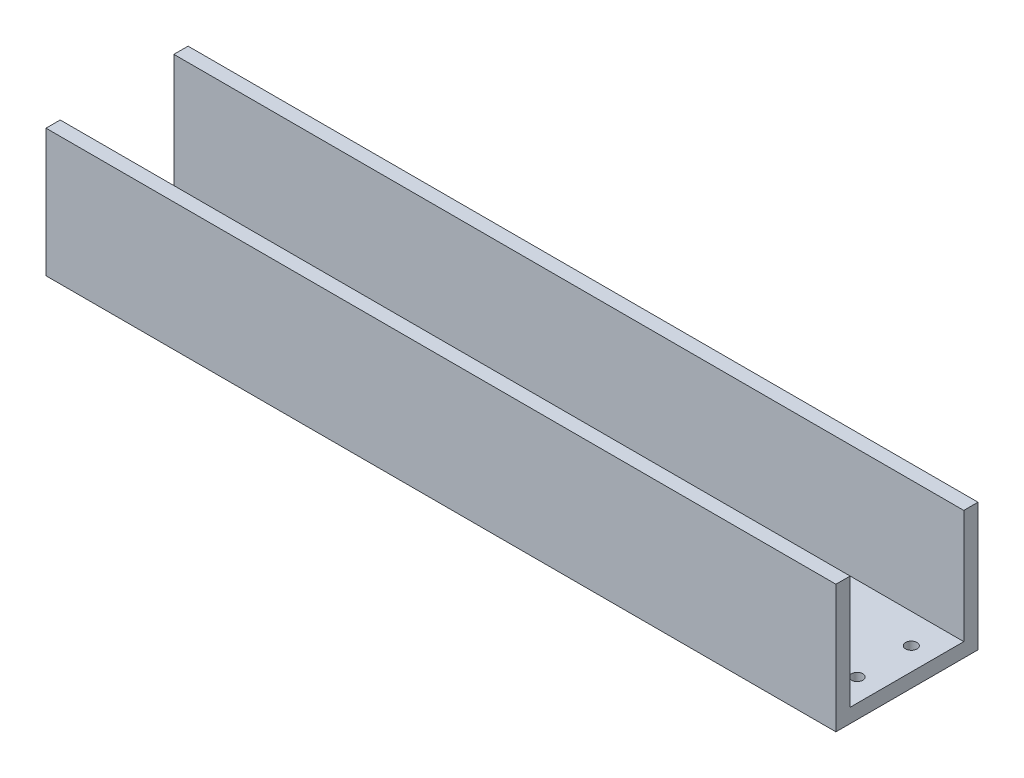
ISO-10303-21;
HEADER;
FILE_DESCRIPTION(('STEP AP214'),'2;1');
FILE_NAME('part.step','',(''),(''),'','','');
FILE_SCHEMA(('AUTOMOTIVE_DESIGN { 1 0 10303 214 1 1 1 1 }'));
ENDSEC;
DATA;
#1=APPLICATION_CONTEXT('core data for automotive mechanical design processes');
#2=APPLICATION_PROTOCOL_DEFINITION('international standard','automotive_design',2000,#1);
#3=PRODUCT_CONTEXT('',#1,'mechanical');
#4=PRODUCT('Part','Part','',(#3));
#5=PRODUCT_RELATED_PRODUCT_CATEGORY('part','',(#4));
#6=PRODUCT_DEFINITION_FORMATION('','',#4);
#7=PRODUCT_DEFINITION_CONTEXT('part definition',#1,'design');
#8=PRODUCT_DEFINITION('design','',#6,#7);
#9=PRODUCT_DEFINITION_SHAPE('','',#8);
#10=(LENGTH_UNIT() NAMED_UNIT(*) SI_UNIT(.MILLI.,.METRE.));
#11=(NAMED_UNIT(*) PLANE_ANGLE_UNIT() SI_UNIT($,.RADIAN.));
#12=(NAMED_UNIT(*) SI_UNIT($,.STERADIAN.) SOLID_ANGLE_UNIT());
#13=UNCERTAINTY_MEASURE_WITH_UNIT(LENGTH_MEASURE(1.E-05),#10,'distance_accuracy_value','');
#14=(GEOMETRIC_REPRESENTATION_CONTEXT(3) GLOBAL_UNCERTAINTY_ASSIGNED_CONTEXT((#13)) GLOBAL_UNIT_ASSIGNED_CONTEXT((#10,
#11,#12)) REPRESENTATION_CONTEXT('',''));
#15=CARTESIAN_POINT('',(0.,0.,0.));
#16=DIRECTION('',(0.,0.,1.));
#17=DIRECTION('',(1.,0.,0.));
#18=AXIS2_PLACEMENT_3D('',#15,#16,#17);
#19=CARTESIAN_POINT('',(278.,45.,0.));
#20=DIRECTION('',(0.,0.,-1.));
#21=DIRECTION('',(0.,1.,0.));
#22=AXIS2_PLACEMENT_3D('',#19,#20,#21);
#23=PLANE('',#22);
#24=DIRECTION('',(0.,-1.,0.));
#25=VECTOR('',#24,1.);
#26=CARTESIAN_POINT('',(0.,45.,0.));
#27=LINE('',#26,#25);
#28=CARTESIAN_POINT('',(0.,45.,0.));
#29=VERTEX_POINT('',#28);
#30=CARTESIAN_POINT('',(0.,0.,0.));
#31=VERTEX_POINT('',#30);
#32=EDGE_CURVE('E140',#29,#31,#27,.T.);
#33=ORIENTED_EDGE('',*,*,#32,.T.);
#34=DIRECTION('',(-1.,0.,0.));
#35=VECTOR('',#34,1.);
#36=CARTESIAN_POINT('',(278.,0.,0.));
#37=LINE('',#36,#35);
#38=CARTESIAN_POINT('',(278.,0.,0.));
#39=VERTEX_POINT('',#38);
#40=EDGE_CURVE('E11',#39,#31,#37,.T.);
#41=ORIENTED_EDGE('',*,*,#40,.F.);
#42=DIRECTION('',(0.,-1.,0.));
#43=VECTOR('',#42,1.);
#44=CARTESIAN_POINT('',(278.,45.,0.));
#45=LINE('',#44,#43);
#46=CARTESIAN_POINT('',(278.,45.,0.));
#47=VERTEX_POINT('',#46);
#48=EDGE_CURVE('E163',#47,#39,#45,.T.);
#49=ORIENTED_EDGE('',*,*,#48,.F.);
#50=DIRECTION('',(-1.,0.,0.));
#51=VECTOR('',#50,1.);
#52=CARTESIAN_POINT('',(278.,45.,0.));
#53=LINE('',#52,#51);
#54=EDGE_CURVE('E136',#47,#29,#53,.T.);
#55=ORIENTED_EDGE('',*,*,#54,.T.);
#56=EDGE_LOOP('',(#33,#41,#49,#55));
#57=FACE_BOUND('',#56,.T.);
#58=ADVANCED_FACE('F39',(#57),#23,.F.);
#59=CARTESIAN_POINT('',(278.,0.,0.));
#60=DIRECTION('',(0.,1.,0.));
#61=DIRECTION('',(0.,0.,1.));
#62=AXIS2_PLACEMENT_3D('',#59,#60,#61);
#63=PLANE('',#62);
#64=CARTESIAN_POINT('',(270.,0.,-34.525));
#65=DIRECTION('',(0.,1.,0.));
#66=DIRECTION('',(0.,0.,1.));
#67=AXIS2_PLACEMENT_3D('',#64,#65,#66);
#68=CIRCLE('',#67,2.);
#69=CARTESIAN_POINT('',(270.,0.,-32.525));
#70=VERTEX_POINT('',#69);
#71=EDGE_CURVE('E231',#70,#70,#68,.F.);
#72=ORIENTED_EDGE('',*,*,#71,.F.);
#73=EDGE_LOOP('',(#72));
#74=FACE_BOUND('',#73,.T.);
#75=CARTESIAN_POINT('',(8.,0.,-34.525));
#76=DIRECTION('',(0.,1.,0.));
#77=DIRECTION('',(0.,0.,1.));
#78=AXIS2_PLACEMENT_3D('',#75,#76,#77);
#79=CIRCLE('',#78,2.);
#80=CARTESIAN_POINT('',(8.,0.,-32.525));
#81=VERTEX_POINT('',#80);
#82=EDGE_CURVE('E224',#81,#81,#79,.F.);
#83=ORIENTED_EDGE('',*,*,#82,.F.);
#84=EDGE_LOOP('',(#83));
#85=FACE_BOUND('',#84,.T.);
#86=CARTESIAN_POINT('',(55.,0.,-15.475));
#87=DIRECTION('',(0.,1.,0.));
#88=DIRECTION('',(0.,0.,1.));
#89=AXIS2_PLACEMENT_3D('',#86,#87,#88);
#90=CIRCLE('',#89,2.);
#91=CARTESIAN_POINT('',(55.,0.,-13.475));
#92=VERTEX_POINT('',#91);
#93=EDGE_CURVE('E215',#92,#92,#90,.F.);
#94=ORIENTED_EDGE('',*,*,#93,.F.);
#95=EDGE_LOOP('',(#94));
#96=FACE_BOUND('',#95,.T.);
#97=CARTESIAN_POINT('',(55.,0.,-34.525));
#98=DIRECTION('',(0.,1.,0.));
#99=DIRECTION('',(0.,0.,1.));
#100=AXIS2_PLACEMENT_3D('',#97,#98,#99);
#101=CIRCLE('',#100,2.);
#102=CARTESIAN_POINT('',(55.,0.,-32.525));
#103=VERTEX_POINT('',#102);
#104=EDGE_CURVE('E214',#103,#103,#101,.F.);
#105=ORIENTED_EDGE('',*,*,#104,.F.);
#106=EDGE_LOOP('',(#105));
#107=FACE_BOUND('',#106,.T.);
#108=CARTESIAN_POINT('',(223.,0.,-34.525));
#109=DIRECTION('',(0.,1.,0.));
#110=DIRECTION('',(0.,0.,1.));
#111=AXIS2_PLACEMENT_3D('',#108,#109,#110);
#112=CIRCLE('',#111,2.);
#113=CARTESIAN_POINT('',(223.,0.,-32.525));
#114=VERTEX_POINT('',#113);
#115=EDGE_CURVE('E240',#114,#114,#112,.F.);
#116=ORIENTED_EDGE('',*,*,#115,.F.);
#117=EDGE_LOOP('',(#116));
#118=FACE_BOUND('',#117,.T.);
#119=CARTESIAN_POINT('',(223.,0.,-15.475));
#120=DIRECTION('',(0.,1.,0.));
#121=DIRECTION('',(0.,0.,1.));
#122=AXIS2_PLACEMENT_3D('',#119,#120,#121);
#123=CIRCLE('',#122,2.);
#124=CARTESIAN_POINT('',(223.,0.,-13.475));
#125=VERTEX_POINT('',#124);
#126=EDGE_CURVE('E256',#125,#125,#123,.F.);
#127=ORIENTED_EDGE('',*,*,#126,.F.);
#128=EDGE_LOOP('',(#127));
#129=FACE_BOUND('',#128,.T.);
#130=CARTESIAN_POINT('',(270.,0.,-15.475));
#131=DIRECTION('',(0.,1.,0.));
#132=DIRECTION('',(0.,0.,1.));
#133=AXIS2_PLACEMENT_3D('',#130,#131,#132);
#134=CIRCLE('',#133,2.);
#135=CARTESIAN_POINT('',(270.,0.,-13.475));
#136=VERTEX_POINT('',#135);
#137=EDGE_CURVE('E247',#136,#136,#134,.F.);
#138=ORIENTED_EDGE('',*,*,#137,.F.);
#139=EDGE_LOOP('',(#138));
#140=FACE_BOUND('',#139,.T.);
#141=CARTESIAN_POINT('',(8.,0.,-15.475));
#142=DIRECTION('',(0.,1.,0.));
#143=DIRECTION('',(0.,0.,1.));
#144=AXIS2_PLACEMENT_3D('',#141,#142,#143);
#145=CIRCLE('',#144,2.);
#146=CARTESIAN_POINT('',(8.,0.,-13.475));
#147=VERTEX_POINT('',#146);
#148=EDGE_CURVE('E145',#147,#147,#145,.F.);
#149=ORIENTED_EDGE('',*,*,#148,.F.);
#150=EDGE_LOOP('',(#149));
#151=FACE_BOUND('',#150,.T.);
#152=DIRECTION('',(0.,0.,-1.));
#153=VECTOR('',#152,1.);
#154=CARTESIAN_POINT('',(0.,0.,0.));
#155=LINE('',#154,#153);
#156=CARTESIAN_POINT('',(0.,0.,-50.));
#157=VERTEX_POINT('',#156);
#158=EDGE_CURVE('E144',#31,#157,#155,.T.);
#159=ORIENTED_EDGE('',*,*,#158,.T.);
#160=DIRECTION('',(-1.,0.,0.));
#161=VECTOR('',#160,1.);
#162=CARTESIAN_POINT('',(278.,0.,-50.));
#163=LINE('',#162,#161);
#164=CARTESIAN_POINT('',(278.,0.,-50.));
#165=VERTEX_POINT('',#164);
#166=EDGE_CURVE('E48',#165,#157,#163,.T.);
#167=ORIENTED_EDGE('',*,*,#166,.F.);
#168=DIRECTION('',(0.,0.,-1.));
#169=VECTOR('',#168,1.);
#170=CARTESIAN_POINT('',(278.,0.,0.));
#171=LINE('',#170,#169);
#172=EDGE_CURVE('E99',#39,#165,#171,.T.);
#173=ORIENTED_EDGE('',*,*,#172,.F.);
#174=ORIENTED_EDGE('',*,*,#40,.T.);
#175=EDGE_LOOP('',(#159,#167,#173,#174));
#176=FACE_BOUND('',#175,.T.);
#177=ADVANCED_FACE('F291',(#74,#85,#96,#107,#118,#129,#140,#151,#176),#63,.F.);
#178=CARTESIAN_POINT('',(278.,0.,-50.));
#179=DIRECTION('',(0.,0.,1.));
#180=DIRECTION('',(0.,-1.,0.));
#181=AXIS2_PLACEMENT_3D('',#178,#179,#180);
#182=PLANE('',#181);
#183=DIRECTION('',(0.,1.,0.));
#184=VECTOR('',#183,1.);
#185=CARTESIAN_POINT('',(0.,0.,-50.));
#186=LINE('',#185,#184);
#187=CARTESIAN_POINT('',(0.,45.,-50.));
#188=VERTEX_POINT('',#187);
#189=EDGE_CURVE('E148',#157,#188,#186,.T.);
#190=ORIENTED_EDGE('',*,*,#189,.T.);
#191=DIRECTION('',(-1.,0.,0.));
#192=VECTOR('',#191,1.);
#193=CARTESIAN_POINT('',(278.,45.,-50.));
#194=LINE('',#193,#192);
#195=CARTESIAN_POINT('',(278.,45.,-50.));
#196=VERTEX_POINT('',#195);
#197=EDGE_CURVE('E174',#196,#188,#194,.T.);
#198=ORIENTED_EDGE('',*,*,#197,.F.);
#199=DIRECTION('',(0.,1.,0.));
#200=VECTOR('',#199,1.);
#201=CARTESIAN_POINT('',(278.,0.,-50.));
#202=LINE('',#201,#200);
#203=EDGE_CURVE('E184',#165,#196,#202,.T.);
#204=ORIENTED_EDGE('',*,*,#203,.F.);
#205=ORIENTED_EDGE('',*,*,#166,.T.);
#206=EDGE_LOOP('',(#190,#198,#204,#205));
#207=FACE_BOUND('',#206,.T.);
#208=ADVANCED_FACE('F182',(#207),#182,.F.);
#209=CARTESIAN_POINT('',(278.,45.,-50.));
#210=DIRECTION('',(0.,-1.,0.));
#211=DIRECTION('',(0.,0.,-1.));
#212=AXIS2_PLACEMENT_3D('',#209,#210,#211);
#213=PLANE('',#212);
#214=DIRECTION('',(0.,0.,1.));
#215=VECTOR('',#214,1.);
#216=CARTESIAN_POINT('',(0.,45.,-50.));
#217=LINE('',#216,#215);
#218=CARTESIAN_POINT('',(0.,45.,-45.));
#219=VERTEX_POINT('',#218);
#220=EDGE_CURVE('E151',#188,#219,#217,.T.);
#221=ORIENTED_EDGE('',*,*,#220,.T.);
#222=DIRECTION('',(-1.,0.,0.));
#223=VECTOR('',#222,1.);
#224=CARTESIAN_POINT('',(278.,45.,-45.));
#225=LINE('',#224,#223);
#226=CARTESIAN_POINT('',(278.,45.,-45.));
#227=VERTEX_POINT('',#226);
#228=EDGE_CURVE('E170',#227,#219,#225,.T.);
#229=ORIENTED_EDGE('',*,*,#228,.F.);
#230=DIRECTION('',(0.,0.,1.));
#231=VECTOR('',#230,1.);
#232=CARTESIAN_POINT('',(278.,45.,-50.));
#233=LINE('',#232,#231);
#234=EDGE_CURVE('E197',#196,#227,#233,.T.);
#235=ORIENTED_EDGE('',*,*,#234,.F.);
#236=ORIENTED_EDGE('',*,*,#197,.T.);
#237=EDGE_LOOP('',(#221,#229,#235,#236));
#238=FACE_BOUND('',#237,.T.);
#239=ADVANCED_FACE('F192',(#238),#213,.F.);
#240=CARTESIAN_POINT('',(278.,45.,-45.));
#241=DIRECTION('',(0.,0.,-1.));
#242=DIRECTION('',(0.,1.,0.));
#243=AXIS2_PLACEMENT_3D('',#240,#241,#242);
#244=PLANE('',#243);
#245=DIRECTION('',(0.,-1.,0.));
#246=VECTOR('',#245,1.);
#247=CARTESIAN_POINT('',(0.,45.,-45.));
#248=LINE('',#247,#246);
#249=CARTESIAN_POINT('',(0.,5.,-45.));
#250=VERTEX_POINT('',#249);
#251=EDGE_CURVE('E154',#219,#250,#248,.T.);
#252=ORIENTED_EDGE('',*,*,#251,.T.);
#253=DIRECTION('',(-1.,0.,0.));
#254=VECTOR('',#253,1.);
#255=CARTESIAN_POINT('',(278.,5.,-45.));
#256=LINE('',#255,#254);
#257=CARTESIAN_POINT('',(278.,5.,-45.));
#258=VERTEX_POINT('',#257);
#259=EDGE_CURVE('E129',#258,#250,#256,.T.);
#260=ORIENTED_EDGE('',*,*,#259,.F.);
#261=DIRECTION('',(0.,-1.,0.));
#262=VECTOR('',#261,1.);
#263=CARTESIAN_POINT('',(278.,45.,-45.));
#264=LINE('',#263,#262);
#265=EDGE_CURVE('E118',#227,#258,#264,.T.);
#266=ORIENTED_EDGE('',*,*,#265,.F.);
#267=ORIENTED_EDGE('',*,*,#228,.T.);
#268=EDGE_LOOP('',(#252,#260,#266,#267));
#269=FACE_BOUND('',#268,.T.);
#270=ADVANCED_FACE('F195',(#269),#244,.F.);
#271=CARTESIAN_POINT('',(278.,5.,-45.));
#272=DIRECTION('',(0.,-1.,0.));
#273=DIRECTION('',(0.,0.,-1.));
#274=AXIS2_PLACEMENT_3D('',#271,#272,#273);
#275=PLANE('',#274);
#276=CARTESIAN_POINT('',(270.,5.,-34.525));
#277=DIRECTION('',(0.,1.,0.));
#278=DIRECTION('',(0.,0.,1.));
#279=AXIS2_PLACEMENT_3D('',#276,#277,#278);
#280=CIRCLE('',#279,2.);
#281=CARTESIAN_POINT('',(270.,5.,-32.525));
#282=VERTEX_POINT('',#281);
#283=EDGE_CURVE('E236',#282,#282,#280,.T.);
#284=ORIENTED_EDGE('',*,*,#283,.F.);
#285=EDGE_LOOP('',(#284));
#286=FACE_BOUND('',#285,.T.);
#287=CARTESIAN_POINT('',(8.,5.,-34.525));
#288=DIRECTION('',(0.,1.,0.));
#289=DIRECTION('',(0.,0.,-1.));
#290=AXIS2_PLACEMENT_3D('',#287,#288,#289);
#291=CIRCLE('',#290,2.);
#292=CARTESIAN_POINT('',(8.,5.,-36.525));
#293=VERTEX_POINT('',#292);
#294=EDGE_CURVE('E235',#293,#293,#291,.T.);
#295=ORIENTED_EDGE('',*,*,#294,.F.);
#296=EDGE_LOOP('',(#295));
#297=FACE_BOUND('',#296,.T.);
#298=CARTESIAN_POINT('',(55.,5.,-15.475));
#299=DIRECTION('',(0.,1.,0.));
#300=DIRECTION('',(0.,0.,1.));
#301=AXIS2_PLACEMENT_3D('',#298,#299,#300);
#302=CIRCLE('',#301,2.);
#303=CARTESIAN_POINT('',(55.,5.,-13.475));
#304=VERTEX_POINT('',#303);
#305=EDGE_CURVE('E220',#304,#304,#302,.T.);
#306=ORIENTED_EDGE('',*,*,#305,.F.);
#307=EDGE_LOOP('',(#306));
#308=FACE_BOUND('',#307,.T.);
#309=CARTESIAN_POINT('',(55.,5.,-34.525));
#310=DIRECTION('',(0.,1.,0.));
#311=DIRECTION('',(0.,0.,-1.));
#312=AXIS2_PLACEMENT_3D('',#309,#310,#311);
#313=CIRCLE('',#312,2.);
#314=CARTESIAN_POINT('',(55.,5.,-36.525));
#315=VERTEX_POINT('',#314);
#316=EDGE_CURVE('E219',#315,#315,#313,.T.);
#317=ORIENTED_EDGE('',*,*,#316,.F.);
#318=EDGE_LOOP('',(#317));
#319=FACE_BOUND('',#318,.T.);
#320=CARTESIAN_POINT('',(223.,5.,-34.525));
#321=DIRECTION('',(0.,1.,0.));
#322=DIRECTION('',(0.,0.,1.));
#323=AXIS2_PLACEMENT_3D('',#320,#321,#322);
#324=CIRCLE('',#323,2.);
#325=CARTESIAN_POINT('',(223.,5.,-32.525));
#326=VERTEX_POINT('',#325);
#327=EDGE_CURVE('E260',#326,#326,#324,.T.);
#328=ORIENTED_EDGE('',*,*,#327,.F.);
#329=EDGE_LOOP('',(#328));
#330=FACE_BOUND('',#329,.T.);
#331=CARTESIAN_POINT('',(223.,5.,-15.475));
#332=DIRECTION('',(0.,1.,0.));
#333=DIRECTION('',(0.,0.,-1.));
#334=AXIS2_PLACEMENT_3D('',#331,#332,#333);
#335=CIRCLE('',#334,2.);
#336=CARTESIAN_POINT('',(223.,5.,-17.475));
#337=VERTEX_POINT('',#336);
#338=EDGE_CURVE('E251',#337,#337,#335,.T.);
#339=ORIENTED_EDGE('',*,*,#338,.F.);
#340=EDGE_LOOP('',(#339));
#341=FACE_BOUND('',#340,.T.);
#342=CARTESIAN_POINT('',(270.,5.,-15.475));
#343=DIRECTION('',(0.,1.,0.));
#344=DIRECTION('',(0.,0.,-1.));
#345=AXIS2_PLACEMENT_3D('',#342,#343,#344);
#346=CIRCLE('',#345,2.);
#347=CARTESIAN_POINT('',(270.,5.,-17.475));
#348=VERTEX_POINT('',#347);
#349=EDGE_CURVE('E252',#348,#348,#346,.T.);
#350=ORIENTED_EDGE('',*,*,#349,.F.);
#351=EDGE_LOOP('',(#350));
#352=FACE_BOUND('',#351,.T.);
#353=CARTESIAN_POINT('',(8.,5.,-15.475));
#354=DIRECTION('',(0.,1.,0.));
#355=DIRECTION('',(0.,0.,1.));
#356=AXIS2_PLACEMENT_3D('',#353,#354,#355);
#357=CIRCLE('',#356,2.);
#358=CARTESIAN_POINT('',(8.,5.,-13.475));
#359=VERTEX_POINT('',#358);
#360=EDGE_CURVE('E210',#359,#359,#357,.T.);
#361=ORIENTED_EDGE('',*,*,#360,.F.);
#362=EDGE_LOOP('',(#361));
#363=FACE_BOUND('',#362,.T.);
#364=DIRECTION('',(0.,0.,1.));
#365=VECTOR('',#364,1.);
#366=CARTESIAN_POINT('',(0.,5.,-45.));
#367=LINE('',#366,#365);
#368=CARTESIAN_POINT('',(0.,4.99999999999999,-5.));
#369=VERTEX_POINT('',#368);
#370=EDGE_CURVE('E127',#250,#369,#367,.T.);
#371=ORIENTED_EDGE('',*,*,#370,.T.);
#372=DIRECTION('',(-1.,0.,0.));
#373=VECTOR('',#372,1.);
#374=CARTESIAN_POINT('',(278.,4.99999999999999,-5.));
#375=LINE('',#374,#373);
#376=CARTESIAN_POINT('',(278.,4.99999999999999,-5.));
#377=VERTEX_POINT('',#376);
#378=EDGE_CURVE('E124',#377,#369,#375,.T.);
#379=ORIENTED_EDGE('',*,*,#378,.F.);
#380=DIRECTION('',(0.,0.,1.));
#381=VECTOR('',#380,1.);
#382=CARTESIAN_POINT('',(278.,5.,-45.));
#383=LINE('',#382,#381);
#384=EDGE_CURVE('E112',#258,#377,#383,.T.);
#385=ORIENTED_EDGE('',*,*,#384,.F.);
#386=ORIENTED_EDGE('',*,*,#259,.T.);
#387=EDGE_LOOP('',(#371,#379,#385,#386));
#388=FACE_BOUND('',#387,.T.);
#389=ADVANCED_FACE('F125',(#286,#297,#308,#319,#330,#341,#352,#363,#388),#275,.F.);
#390=CARTESIAN_POINT('',(278.,4.99999999999999,-5.));
#391=DIRECTION('',(0.,0.,1.));
#392=DIRECTION('',(0.,-1.,0.));
#393=AXIS2_PLACEMENT_3D('',#390,#391,#392);
#394=PLANE('',#393);
#395=DIRECTION('',(0.,1.,0.));
#396=VECTOR('',#395,1.);
#397=CARTESIAN_POINT('',(0.,4.99999999999999,-5.));
#398=LINE('',#397,#396);
#399=CARTESIAN_POINT('',(0.,45.,-4.99999999999999));
#400=VERTEX_POINT('',#399);
#401=EDGE_CURVE('E85',#369,#400,#398,.T.);
#402=ORIENTED_EDGE('',*,*,#401,.T.);
#403=DIRECTION('',(-1.,0.,0.));
#404=VECTOR('',#403,1.);
#405=CARTESIAN_POINT('',(278.,45.,-4.99999999999999));
#406=LINE('',#405,#404);
#407=CARTESIAN_POINT('',(278.,45.,-4.99999999999999));
#408=VERTEX_POINT('',#407);
#409=EDGE_CURVE('E130',#408,#400,#406,.T.);
#410=ORIENTED_EDGE('',*,*,#409,.F.);
#411=DIRECTION('',(0.,1.,0.));
#412=VECTOR('',#411,1.);
#413=CARTESIAN_POINT('',(278.,4.99999999999999,-5.));
#414=LINE('',#413,#412);
#415=EDGE_CURVE('E116',#377,#408,#414,.T.);
#416=ORIENTED_EDGE('',*,*,#415,.F.);
#417=ORIENTED_EDGE('',*,*,#378,.T.);
#418=EDGE_LOOP('',(#402,#410,#416,#417));
#419=FACE_BOUND('',#418,.T.);
#420=ADVANCED_FACE('F132',(#419),#394,.F.);
#421=CARTESIAN_POINT('',(278.,45.,-4.99999999999999));
#422=DIRECTION('',(0.,-1.,0.));
#423=DIRECTION('',(0.,0.,-1.));
#424=AXIS2_PLACEMENT_3D('',#421,#422,#423);
#425=PLANE('',#424);
#426=DIRECTION('',(0.,0.,1.));
#427=VECTOR('',#426,1.);
#428=CARTESIAN_POINT('',(0.,45.,-4.99999999999999));
#429=LINE('',#428,#427);
#430=EDGE_CURVE('E91',#400,#29,#429,.T.);
#431=ORIENTED_EDGE('',*,*,#430,.T.);
#432=ORIENTED_EDGE('',*,*,#54,.F.);
#433=DIRECTION('',(0.,0.,1.));
#434=VECTOR('',#433,1.);
#435=CARTESIAN_POINT('',(278.,45.,-4.99999999999999));
#436=LINE('',#435,#434);
#437=EDGE_CURVE('E56',#408,#47,#436,.T.);
#438=ORIENTED_EDGE('',*,*,#437,.F.);
#439=ORIENTED_EDGE('',*,*,#409,.T.);
#440=EDGE_LOOP('',(#431,#432,#438,#439));
#441=FACE_BOUND('',#440,.T.);
#442=ADVANCED_FACE('F297',(#441),#425,.F.);
#443=CARTESIAN_POINT('',(278.,0.,0.));
#444=DIRECTION('',(1.,0.,0.));
#445=DIRECTION('',(0.,0.,-1.));
#446=AXIS2_PLACEMENT_3D('',#443,#444,#445);
#447=PLANE('',#446);
#448=ORIENTED_EDGE('',*,*,#48,.T.);
#449=ORIENTED_EDGE('',*,*,#172,.T.);
#450=ORIENTED_EDGE('',*,*,#203,.T.);
#451=ORIENTED_EDGE('',*,*,#234,.T.);
#452=ORIENTED_EDGE('',*,*,#265,.T.);
#453=ORIENTED_EDGE('',*,*,#384,.T.);
#454=ORIENTED_EDGE('',*,*,#415,.T.);
#455=ORIENTED_EDGE('',*,*,#437,.T.);
#456=EDGE_LOOP('',(#448,#449,#450,#451,#452,#453,#454,#455));
#457=FACE_BOUND('',#456,.T.);
#458=ADVANCED_FACE('F114',(#457),#447,.T.);
#459=CARTESIAN_POINT('',(0.,0.,0.));
#460=DIRECTION('',(1.,0.,0.));
#461=DIRECTION('',(0.,0.,-1.));
#462=AXIS2_PLACEMENT_3D('',#459,#460,#461);
#463=PLANE('',#462);
#464=ORIENTED_EDGE('',*,*,#32,.F.);
#465=ORIENTED_EDGE('',*,*,#430,.F.);
#466=ORIENTED_EDGE('',*,*,#401,.F.);
#467=ORIENTED_EDGE('',*,*,#370,.F.);
#468=ORIENTED_EDGE('',*,*,#251,.F.);
#469=ORIENTED_EDGE('',*,*,#220,.F.);
#470=ORIENTED_EDGE('',*,*,#189,.F.);
#471=ORIENTED_EDGE('',*,*,#158,.F.);
#472=EDGE_LOOP('',(#464,#465,#466,#467,#468,#469,#470,#471));
#473=FACE_BOUND('',#472,.T.);
#474=ADVANCED_FACE('F188',(#473),#463,.F.);
#475=CARTESIAN_POINT('',(8.,-0.00100000000000447,-15.475));
#476=DIRECTION('',(0.,1.,0.));
#477=DIRECTION('',(0.,0.,1.));
#478=AXIS2_PLACEMENT_3D('',#475,#476,#477);
#479=CYLINDRICAL_SURFACE('',#478,2.);
#480=ORIENTED_EDGE('',*,*,#360,.T.);
#481=EDGE_LOOP('',(#480));
#482=FACE_BOUND('',#481,.T.);
#483=ORIENTED_EDGE('',*,*,#148,.T.);
#484=EDGE_LOOP('',(#483));
#485=FACE_BOUND('',#484,.T.);
#486=ADVANCED_FACE('F284',(#482,#485),#479,.F.);
#487=CARTESIAN_POINT('',(270.,-0.00100000000000447,-15.475));
#488=DIRECTION('',(0.,1.,0.));
#489=DIRECTION('',(0.,0.,1.));
#490=AXIS2_PLACEMENT_3D('',#487,#488,#489);
#491=CYLINDRICAL_SURFACE('',#490,2.);
#492=ORIENTED_EDGE('',*,*,#349,.T.);
#493=EDGE_LOOP('',(#492));
#494=FACE_BOUND('',#493,.T.);
#495=ORIENTED_EDGE('',*,*,#137,.T.);
#496=EDGE_LOOP('',(#495));
#497=FACE_BOUND('',#496,.T.);
#498=ADVANCED_FACE('F287',(#494,#497),#491,.F.);
#499=CARTESIAN_POINT('',(223.,-0.00100000000000447,-15.475));
#500=DIRECTION('',(0.,1.,0.));
#501=DIRECTION('',(0.,0.,1.));
#502=AXIS2_PLACEMENT_3D('',#499,#500,#501);
#503=CYLINDRICAL_SURFACE('',#502,2.);
#504=ORIENTED_EDGE('',*,*,#338,.T.);
#505=EDGE_LOOP('',(#504));
#506=FACE_BOUND('',#505,.T.);
#507=ORIENTED_EDGE('',*,*,#126,.T.);
#508=EDGE_LOOP('',(#507));
#509=FACE_BOUND('',#508,.T.);
#510=ADVANCED_FACE('F369',(#506,#509),#503,.F.);
#511=CARTESIAN_POINT('',(223.,-0.00100000000000187,-34.525));
#512=DIRECTION('',(0.,1.,0.));
#513=DIRECTION('',(0.,0.,1.));
#514=AXIS2_PLACEMENT_3D('',#511,#512,#513);
#515=CYLINDRICAL_SURFACE('',#514,2.);
#516=ORIENTED_EDGE('',*,*,#327,.T.);
#517=EDGE_LOOP('',(#516));
#518=FACE_BOUND('',#517,.T.);
#519=ORIENTED_EDGE('',*,*,#115,.T.);
#520=EDGE_LOOP('',(#519));
#521=FACE_BOUND('',#520,.T.);
#522=ADVANCED_FACE('F271',(#518,#521),#515,.F.);
#523=CARTESIAN_POINT('',(55.,-0.00100000000000187,-34.525));
#524=DIRECTION('',(0.,1.,0.));
#525=DIRECTION('',(0.,0.,1.));
#526=AXIS2_PLACEMENT_3D('',#523,#524,#525);
#527=CYLINDRICAL_SURFACE('',#526,2.);
#528=ORIENTED_EDGE('',*,*,#316,.T.);
#529=EDGE_LOOP('',(#528));
#530=FACE_BOUND('',#529,.T.);
#531=ORIENTED_EDGE('',*,*,#104,.T.);
#532=EDGE_LOOP('',(#531));
#533=FACE_BOUND('',#532,.T.);
#534=ADVANCED_FACE('F384',(#530,#533),#527,.F.);
#535=CARTESIAN_POINT('',(55.,-0.00100000000000447,-15.475));
#536=DIRECTION('',(0.,1.,0.));
#537=DIRECTION('',(0.,0.,1.));
#538=AXIS2_PLACEMENT_3D('',#535,#536,#537);
#539=CYLINDRICAL_SURFACE('',#538,2.);
#540=ORIENTED_EDGE('',*,*,#305,.T.);
#541=EDGE_LOOP('',(#540));
#542=FACE_BOUND('',#541,.T.);
#543=ORIENTED_EDGE('',*,*,#93,.T.);
#544=EDGE_LOOP('',(#543));
#545=FACE_BOUND('',#544,.T.);
#546=ADVANCED_FACE('F391',(#542,#545),#539,.F.);
#547=CARTESIAN_POINT('',(8.,-0.00100000000000187,-34.525));
#548=DIRECTION('',(0.,1.,0.));
#549=DIRECTION('',(0.,0.,1.));
#550=AXIS2_PLACEMENT_3D('',#547,#548,#549);
#551=CYLINDRICAL_SURFACE('',#550,2.);
#552=ORIENTED_EDGE('',*,*,#294,.T.);
#553=EDGE_LOOP('',(#552));
#554=FACE_BOUND('',#553,.T.);
#555=ORIENTED_EDGE('',*,*,#82,.T.);
#556=EDGE_LOOP('',(#555));
#557=FACE_BOUND('',#556,.T.);
#558=ADVANCED_FACE('F399',(#554,#557),#551,.F.);
#559=CARTESIAN_POINT('',(270.,-0.00100000000000187,-34.525));
#560=DIRECTION('',(0.,1.,0.));
#561=DIRECTION('',(0.,0.,1.));
#562=AXIS2_PLACEMENT_3D('',#559,#560,#561);
#563=CYLINDRICAL_SURFACE('',#562,2.);
#564=ORIENTED_EDGE('',*,*,#283,.T.);
#565=EDGE_LOOP('',(#564));
#566=FACE_BOUND('',#565,.T.);
#567=ORIENTED_EDGE('',*,*,#71,.T.);
#568=EDGE_LOOP('',(#567));
#569=FACE_BOUND('',#568,.T.);
#570=ADVANCED_FACE('F407',(#566,#569),#563,.F.);
#571=CLOSED_SHELL('',(#58,#177,#208,#239,#270,#389,#420,#442,#458,#474,#486,#498,#510,#522,#534,
#546,#558,#570));
#572=MANIFOLD_SOLID_BREP('B2',#571);
#573=ADVANCED_BREP_SHAPE_REPRESENTATION('',(#18,#572),#14);
#574=SHAPE_DEFINITION_REPRESENTATION(#9,#573);
ENDSEC;
END-ISO-10303-21;
